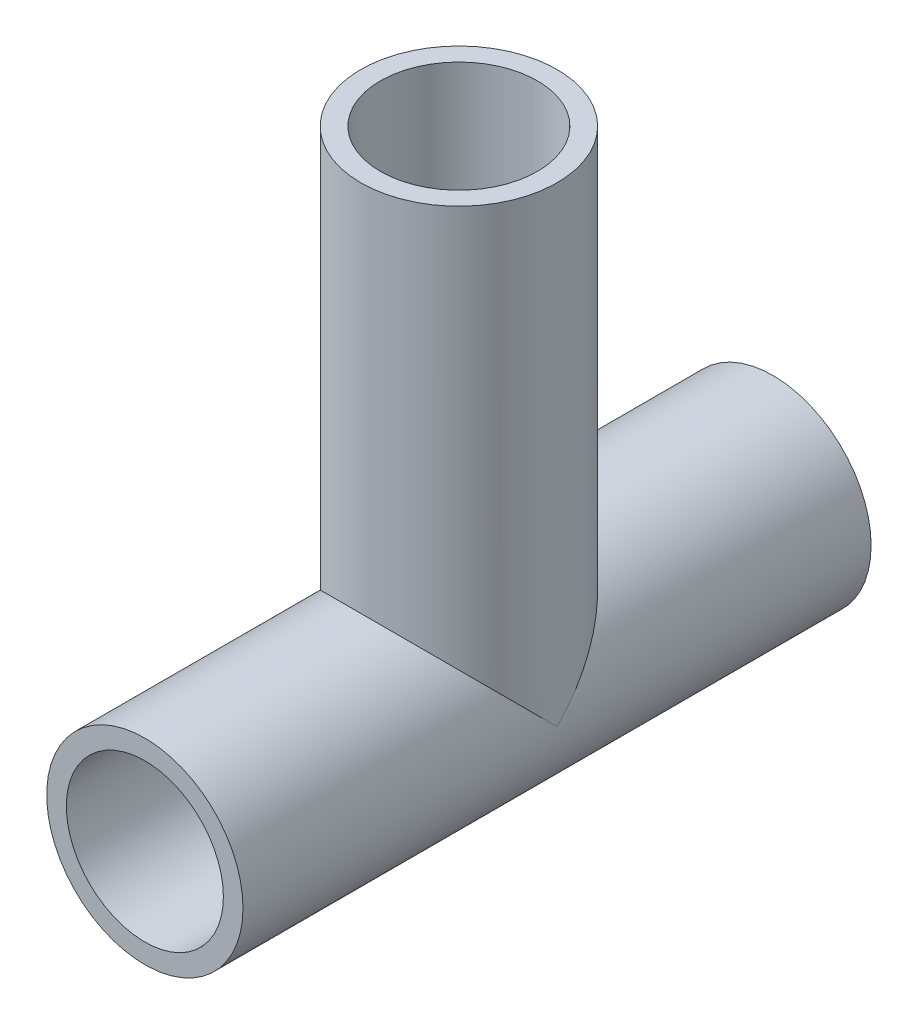
ISO-10303-21;
HEADER;
FILE_DESCRIPTION(('STEP AP214'),'2;1');
FILE_NAME('part.step','',(''),(''),'','','');
FILE_SCHEMA(('AUTOMOTIVE_DESIGN { 1 0 10303 214 1 1 1 1 }'));
ENDSEC;
DATA;
#1=APPLICATION_CONTEXT('core data for automotive mechanical design processes');
#2=APPLICATION_PROTOCOL_DEFINITION('international standard','automotive_design',2000,#1);
#3=PRODUCT_CONTEXT('',#1,'mechanical');
#4=PRODUCT('Part','Part','',(#3));
#5=PRODUCT_RELATED_PRODUCT_CATEGORY('part','',(#4));
#6=PRODUCT_DEFINITION_FORMATION('','',#4);
#7=PRODUCT_DEFINITION_CONTEXT('part definition',#1,'design');
#8=PRODUCT_DEFINITION('design','',#6,#7);
#9=PRODUCT_DEFINITION_SHAPE('','',#8);
#10=(LENGTH_UNIT() NAMED_UNIT(*) SI_UNIT(.MILLI.,.METRE.));
#11=(NAMED_UNIT(*) PLANE_ANGLE_UNIT() SI_UNIT($,.RADIAN.));
#12=(NAMED_UNIT(*) SI_UNIT($,.STERADIAN.) SOLID_ANGLE_UNIT());
#13=UNCERTAINTY_MEASURE_WITH_UNIT(LENGTH_MEASURE(1.E-05),#10,'distance_accuracy_value','');
#14=(GEOMETRIC_REPRESENTATION_CONTEXT(3) GLOBAL_UNCERTAINTY_ASSIGNED_CONTEXT((#13)) GLOBAL_UNIT_ASSIGNED_CONTEXT((#10,
#11,#12)) REPRESENTATION_CONTEXT('',''));
#15=CARTESIAN_POINT('',(0.,0.,0.));
#16=DIRECTION('',(0.,0.,1.));
#17=DIRECTION('',(1.,0.,0.));
#18=AXIS2_PLACEMENT_3D('',#15,#16,#17);
#19=CARTESIAN_POINT('',(0.,0.,40.));
#20=DIRECTION('',(0.,0.,1.));
#21=DIRECTION('',(1.,0.,0.));
#22=AXIS2_PLACEMENT_3D('',#19,#20,#21);
#23=PLANE('',#22);
#24=CARTESIAN_POINT('',(0.,0.,40.));
#25=DIRECTION('',(0.,0.,1.));
#26=DIRECTION('',(1.,0.,0.));
#27=AXIS2_PLACEMENT_3D('',#24,#25,#26);
#28=CIRCLE('',#27,12.5);
#29=CARTESIAN_POINT('',(12.5,0.,40.));
#30=VERTEX_POINT('',#29);
#31=EDGE_CURVE('E11',#30,#30,#28,.T.);
#32=ORIENTED_EDGE('',*,*,#31,.T.);
#33=EDGE_LOOP('',(#32));
#34=FACE_BOUND('',#33,.T.);
#35=CARTESIAN_POINT('',(0.,0.,40.));
#36=DIRECTION('',(0.,0.,1.));
#37=DIRECTION('',(1.,0.,0.));
#38=AXIS2_PLACEMENT_3D('',#35,#36,#37);
#39=CIRCLE('',#38,10.);
#40=CARTESIAN_POINT('',(10.,0.,40.));
#41=VERTEX_POINT('',#40);
#42=EDGE_CURVE('E90',#41,#41,#39,.T.);
#43=ORIENTED_EDGE('',*,*,#42,.F.);
#44=EDGE_LOOP('',(#43));
#45=FACE_BOUND('',#44,.T.);
#46=ADVANCED_FACE('F39',(#34,#45),#23,.T.);
#47=CARTESIAN_POINT('',(0.,0.,-40.));
#48=DIRECTION('',(0.,0.,1.));
#49=DIRECTION('',(1.,0.,0.));
#50=AXIS2_PLACEMENT_3D('',#47,#48,#49);
#51=PLANE('',#50);
#52=CARTESIAN_POINT('',(0.,0.,-40.));
#53=DIRECTION('',(0.,0.,1.));
#54=DIRECTION('',(1.,0.,0.));
#55=AXIS2_PLACEMENT_3D('',#52,#53,#54);
#56=CIRCLE('',#55,12.5);
#57=CARTESIAN_POINT('',(12.5,0.,-40.));
#58=VERTEX_POINT('',#57);
#59=EDGE_CURVE('E43',#58,#58,#56,.T.);
#60=ORIENTED_EDGE('',*,*,#59,.F.);
#61=EDGE_LOOP('',(#60));
#62=FACE_BOUND('',#61,.T.);
#63=CARTESIAN_POINT('',(0.,0.,-40.));
#64=DIRECTION('',(0.,0.,1.));
#65=DIRECTION('',(1.,0.,0.));
#66=AXIS2_PLACEMENT_3D('',#63,#64,#65);
#67=CIRCLE('',#66,10.);
#68=CARTESIAN_POINT('',(10.,0.,-40.));
#69=VERTEX_POINT('',#68);
#70=EDGE_CURVE('E84',#69,#69,#67,.T.);
#71=ORIENTED_EDGE('',*,*,#70,.T.);
#72=EDGE_LOOP('',(#71));
#73=FACE_BOUND('',#72,.T.);
#74=ADVANCED_FACE('F98',(#62,#73),#51,.F.);
#75=CARTESIAN_POINT('',(0.,0.,40.));
#76=DIRECTION('',(0.,0.,-1.));
#77=DIRECTION('',(-1.,0.,0.));
#78=AXIS2_PLACEMENT_3D('',#75,#76,#77);
#79=CYLINDRICAL_SURFACE('',#78,12.5);
#80=CARTESIAN_POINT('',(0.,0.,0.));
#81=DIRECTION('',(0.,0.707106781186547,0.707106781186547));
#82=DIRECTION('',(0.,0.707106781186547,-0.707106781186547));
#83=AXIS2_PLACEMENT_3D('',#80,#81,#82);
#84=ELLIPSE('',#83,17.6776695296637,12.5);
#85=CARTESIAN_POINT('',(12.5,0.,0.));
#86=VERTEX_POINT('',#85);
#87=CARTESIAN_POINT('',(-12.5,0.,0.));
#88=VERTEX_POINT('',#87);
#89=EDGE_CURVE('E81',#86,#88,#84,.T.);
#90=ORIENTED_EDGE('',*,*,#89,.F.);
#91=CARTESIAN_POINT('',(0.,0.,0.));
#92=DIRECTION('',(0.,0.707106781186547,-0.707106781186547));
#93=DIRECTION('',(0.,0.707106781186547,0.707106781186547));
#94=AXIS2_PLACEMENT_3D('',#91,#92,#93);
#95=ELLIPSE('',#94,17.6776695296637,12.5);
#96=EDGE_CURVE('E61',#88,#86,#95,.T.);
#97=ORIENTED_EDGE('',*,*,#96,.F.);
#98=EDGE_LOOP('',(#90,#97));
#99=FACE_BOUND('',#98,.T.);
#100=ORIENTED_EDGE('',*,*,#31,.F.);
#101=EDGE_LOOP('',(#100));
#102=FACE_BOUND('',#101,.T.);
#103=ORIENTED_EDGE('',*,*,#59,.T.);
#104=EDGE_LOOP('',(#103));
#105=FACE_BOUND('',#104,.T.);
#106=ADVANCED_FACE('F41',(#99,#102,#105),#79,.T.);
#107=CARTESIAN_POINT('',(0.,0.,40.));
#108=DIRECTION('',(0.,0.,-1.));
#109=DIRECTION('',(-1.,0.,0.));
#110=AXIS2_PLACEMENT_3D('',#107,#108,#109);
#111=CYLINDRICAL_SURFACE('',#110,10.);
#112=CARTESIAN_POINT('',(0.,0.,0.));
#113=DIRECTION('',(0.,0.707106781186547,-0.707106781186547));
#114=DIRECTION('',(0.,-0.707106781186547,-0.707106781186547));
#115=AXIS2_PLACEMENT_3D('',#112,#113,#114);
#116=ELLIPSE('',#115,14.1421356237309,10.);
#117=CARTESIAN_POINT('',(10.,0.,0.));
#118=VERTEX_POINT('',#117);
#119=CARTESIAN_POINT('',(-10.,0.,0.));
#120=VERTEX_POINT('',#119);
#121=EDGE_CURVE('E54',#118,#120,#116,.F.);
#122=ORIENTED_EDGE('',*,*,#121,.F.);
#123=CARTESIAN_POINT('',(0.,0.,0.));
#124=DIRECTION('',(0.,-0.707106781186547,-0.707106781186547));
#125=DIRECTION('',(0.,0.707106781186547,-0.707106781186547));
#126=AXIS2_PLACEMENT_3D('',#123,#124,#125);
#127=ELLIPSE('',#126,14.1421356237309,10.);
#128=EDGE_CURVE('E66',#120,#118,#127,.T.);
#129=ORIENTED_EDGE('',*,*,#128,.F.);
#130=EDGE_LOOP('',(#122,#129));
#131=FACE_BOUND('',#130,.T.);
#132=ORIENTED_EDGE('',*,*,#42,.T.);
#133=EDGE_LOOP('',(#132));
#134=FACE_BOUND('',#133,.T.);
#135=ORIENTED_EDGE('',*,*,#70,.F.);
#136=EDGE_LOOP('',(#135));
#137=FACE_BOUND('',#136,.T.);
#138=ADVANCED_FACE('F71',(#131,#134,#137),#111,.F.);
#139=CARTESIAN_POINT('',(0.,-12.501,0.));
#140=DIRECTION('',(0.,1.,0.));
#141=DIRECTION('',(0.,0.,1.));
#142=AXIS2_PLACEMENT_3D('',#139,#140,#141);
#143=CYLINDRICAL_SURFACE('',#142,12.5);
#144=CARTESIAN_POINT('',(0.,60.,0.));
#145=DIRECTION('',(0.,1.,0.));
#146=DIRECTION('',(0.,0.,1.));
#147=AXIS2_PLACEMENT_3D('',#144,#145,#146);
#148=CIRCLE('',#147,12.5);
#149=CARTESIAN_POINT('',(0.,60.,12.5));
#150=VERTEX_POINT('',#149);
#151=EDGE_CURVE('E78',#150,#150,#148,.T.);
#152=ORIENTED_EDGE('',*,*,#151,.F.);
#153=EDGE_LOOP('',(#152));
#154=FACE_BOUND('',#153,.T.);
#155=ORIENTED_EDGE('',*,*,#89,.T.);
#156=ORIENTED_EDGE('',*,*,#96,.T.);
#157=EDGE_LOOP('',(#155,#156));
#158=FACE_BOUND('',#157,.T.);
#159=ADVANCED_FACE('F101',(#154,#158),#143,.T.);
#160=CARTESIAN_POINT('',(0.,60.,0.));
#161=DIRECTION('',(0.,1.,0.));
#162=DIRECTION('',(0.,0.,1.));
#163=AXIS2_PLACEMENT_3D('',#160,#161,#162);
#164=PLANE('',#163);
#165=CARTESIAN_POINT('',(0.,60.,0.));
#166=DIRECTION('',(0.,1.,0.));
#167=DIRECTION('',(0.,0.,1.));
#168=AXIS2_PLACEMENT_3D('',#165,#166,#167);
#169=CIRCLE('',#168,10.);
#170=CARTESIAN_POINT('',(0.,60.,10.));
#171=VERTEX_POINT('',#170);
#172=EDGE_CURVE('E74',#171,#171,#169,.T.);
#173=ORIENTED_EDGE('',*,*,#172,.F.);
#174=EDGE_LOOP('',(#173));
#175=FACE_BOUND('',#174,.T.);
#176=ORIENTED_EDGE('',*,*,#151,.T.);
#177=EDGE_LOOP('',(#176));
#178=FACE_BOUND('',#177,.T.);
#179=ADVANCED_FACE('F107',(#175,#178),#164,.T.);
#180=CARTESIAN_POINT('',(0.,-12.501,0.));
#181=DIRECTION('',(0.,1.,0.));
#182=DIRECTION('',(0.,0.,1.));
#183=AXIS2_PLACEMENT_3D('',#180,#181,#182);
#184=CYLINDRICAL_SURFACE('',#183,10.);
#185=ORIENTED_EDGE('',*,*,#172,.T.);
#186=EDGE_LOOP('',(#185));
#187=FACE_BOUND('',#186,.T.);
#188=ORIENTED_EDGE('',*,*,#121,.T.);
#189=ORIENTED_EDGE('',*,*,#128,.T.);
#190=EDGE_LOOP('',(#188,#189));
#191=FACE_BOUND('',#190,.T.);
#192=ADVANCED_FACE('F67',(#187,#191),#184,.F.);
#193=CLOSED_SHELL('',(#46,#74,#106,#138,#159,#179,#192));
#194=MANIFOLD_SOLID_BREP('B2',#193);
#195=ADVANCED_BREP_SHAPE_REPRESENTATION('',(#18,#194),#14);
#196=SHAPE_DEFINITION_REPRESENTATION(#9,#195);
ENDSEC;
END-ISO-10303-21;
